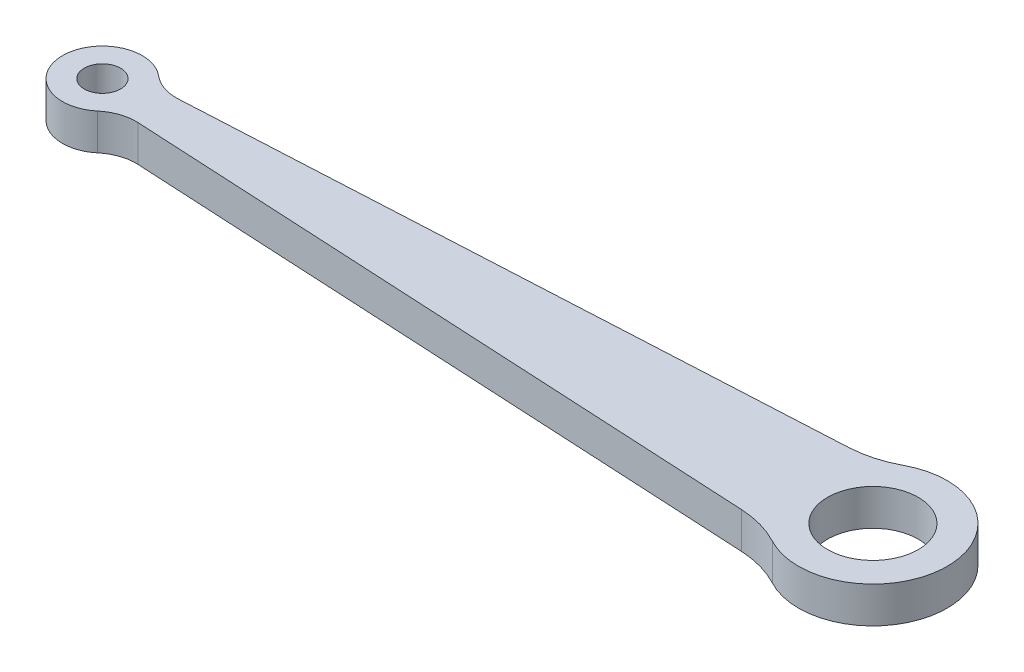
ISO-10303-21;
HEADER;
FILE_DESCRIPTION(('STEP AP214'),'2;1');
FILE_NAME('part.step','',(''),(''),'','','');
FILE_SCHEMA(('AUTOMOTIVE_DESIGN { 1 0 10303 214 1 1 1 1 }'));
ENDSEC;
DATA;
#1=APPLICATION_CONTEXT('core data for automotive mechanical design processes');
#2=APPLICATION_PROTOCOL_DEFINITION('international standard','automotive_design',2000,#1);
#3=PRODUCT_CONTEXT('',#1,'mechanical');
#4=PRODUCT('Part','Part','',(#3));
#5=PRODUCT_RELATED_PRODUCT_CATEGORY('part','',(#4));
#6=PRODUCT_DEFINITION_FORMATION('','',#4);
#7=PRODUCT_DEFINITION_CONTEXT('part definition',#1,'design');
#8=PRODUCT_DEFINITION('design','',#6,#7);
#9=PRODUCT_DEFINITION_SHAPE('','',#8);
#10=(LENGTH_UNIT() NAMED_UNIT(*) SI_UNIT(.MILLI.,.METRE.));
#11=(NAMED_UNIT(*) PLANE_ANGLE_UNIT() SI_UNIT($,.RADIAN.));
#12=(NAMED_UNIT(*) SI_UNIT($,.STERADIAN.) SOLID_ANGLE_UNIT());
#13=UNCERTAINTY_MEASURE_WITH_UNIT(LENGTH_MEASURE(1.E-05),#10,'distance_accuracy_value','');
#14=(GEOMETRIC_REPRESENTATION_CONTEXT(3) GLOBAL_UNCERTAINTY_ASSIGNED_CONTEXT((#13)) GLOBAL_UNIT_ASSIGNED_CONTEXT((#10,
#11,#12)) REPRESENTATION_CONTEXT('',''));
#15=CARTESIAN_POINT('',(0.,0.,0.));
#16=DIRECTION('',(0.,0.,1.));
#17=DIRECTION('',(1.,0.,0.));
#18=AXIS2_PLACEMENT_3D('',#15,#16,#17);
#19=CARTESIAN_POINT('',(4.70734427929749,3.175,-5.58277852741493));
#20=DIRECTION('',(0.,1.,0.));
#21=DIRECTION('',(0.,0.,1.));
#22=AXIS2_PLACEMENT_3D('',#19,#20,#21);
#23=PLANE('',#22);
#24=CARTESIAN_POINT('',(0.,3.175,0.));
#25=DIRECTION('',(0.,1.,0.));
#26=DIRECTION('',(0.,0.,1.));
#27=AXIS2_PLACEMENT_3D('',#24,#25,#26);
#28=CIRCLE('',#27,1.5875);
#29=CARTESIAN_POINT('',(0.,3.175,1.5875));
#30=VERTEX_POINT('',#29);
#31=EDGE_CURVE('E134',#30,#30,#28,.T.);
#32=ORIENTED_EDGE('',*,*,#31,.F.);
#33=EDGE_LOOP('',(#32));
#34=FACE_BOUND('',#33,.T.);
#35=CARTESIAN_POINT('',(4.70734427929749,3.175,-5.58277852741493));
#36=DIRECTION('',(0.,-1.,0.));
#37=DIRECTION('',(0.,0.,1.));
#38=AXIS2_PLACEMENT_3D('',#35,#36,#37);
#39=CIRCLE('',#38,3.81);
#40=CARTESIAN_POINT('',(4.90674427258311,3.175,-1.778));
#41=VERTEX_POINT('',#40);
#42=CARTESIAN_POINT('',(2.25133856835967,3.175,-2.67002451311149));
#43=VERTEX_POINT('',#42);
#44=EDGE_CURVE('E145',#41,#43,#39,.T.);
#45=ORIENTED_EDGE('',*,*,#44,.T.);
#46=CARTESIAN_POINT('',(0.,3.175,0.));
#47=DIRECTION('',(0.,1.,0.));
#48=DIRECTION('',(0.,0.,1.));
#49=AXIS2_PLACEMENT_3D('',#46,#47,#48);
#50=CIRCLE('',#49,3.4925);
#51=CARTESIAN_POINT('',(2.25133856835967,3.175,2.67002451311149));
#52=VERTEX_POINT('',#51);
#53=EDGE_CURVE('E93',#43,#52,#50,.T.);
#54=ORIENTED_EDGE('',*,*,#53,.T.);
#55=CARTESIAN_POINT('',(4.70734427929749,3.175,5.58277852741493));
#56=DIRECTION('',(0.,-1.,0.));
#57=DIRECTION('',(0.,0.,-1.));
#58=AXIS2_PLACEMENT_3D('',#55,#56,#57);
#59=CIRCLE('',#58,3.81);
#60=CARTESIAN_POINT('',(4.90674427258311,3.175,1.778));
#61=VERTEX_POINT('',#60);
#62=EDGE_CURVE('E160',#52,#61,#59,.T.);
#63=ORIENTED_EDGE('',*,*,#62,.T.);
#64=DIRECTION('',(0.998629534754574,0.,0.052335956242944));
#65=VECTOR('',#64,1.);
#66=CARTESIAN_POINT('',(4.90674427258311,3.175,1.778));
#67=LINE('',#66,#65);
#68=CARTESIAN_POINT('',(60.6639655636608,3.175,4.70011214685849));
#69=VERTEX_POINT('',#68);
#70=EDGE_CURVE('E173',#61,#69,#67,.T.);
#71=ORIENTED_EDGE('',*,*,#70,.T.);
#72=CARTESIAN_POINT('',(60.198698912661,3.175,13.5779287108267));
#73=DIRECTION('',(0.,-1.,0.));
#74=DIRECTION('',(0.,0.,-1.));
#75=AXIS2_PLACEMENT_3D('',#72,#73,#74);
#76=CIRCLE('',#75,8.89);
#77=CARTESIAN_POINT('',(64.3921758290629,3.175,5.73912450663807));
#78=VERTEX_POINT('',#77);
#79=EDGE_CURVE('E112',#69,#78,#76,.T.);
#80=ORIENTED_EDGE('',*,*,#79,.T.);
#81=CARTESIAN_POINT('',(67.4624,3.175,0.));
#82=DIRECTION('',(0.,1.,0.));
#83=DIRECTION('',(0.,0.,1.));
#84=AXIS2_PLACEMENT_3D('',#81,#82,#83);
#85=CIRCLE('',#84,6.50875);
#86=CARTESIAN_POINT('',(64.3921758290629,3.175,-5.73912450663807));
#87=VERTEX_POINT('',#86);
#88=EDGE_CURVE('E106',#78,#87,#85,.T.);
#89=ORIENTED_EDGE('',*,*,#88,.T.);
#90=CARTESIAN_POINT('',(60.1986989126611,3.175,-13.5779287108267));
#91=DIRECTION('',(0.,-1.,0.));
#92=DIRECTION('',(0.,0.,1.));
#93=AXIS2_PLACEMENT_3D('',#90,#91,#92);
#94=CIRCLE('',#93,8.88999999999999);
#95=CARTESIAN_POINT('',(60.6639655636609,3.175,-4.70011214685852));
#96=VERTEX_POINT('',#95);
#97=EDGE_CURVE('E110',#87,#96,#94,.T.);
#98=ORIENTED_EDGE('',*,*,#97,.T.);
#99=DIRECTION('',(-0.998629534754574,0.,0.0523359562429444));
#100=VECTOR('',#99,1.);
#101=CARTESIAN_POINT('',(4.90674427258311,3.175,-1.778));
#102=LINE('',#101,#100);
#103=EDGE_CURVE('E50',#96,#41,#102,.T.);
#104=ORIENTED_EDGE('',*,*,#103,.T.);
#105=EDGE_LOOP('',(#45,#54,#63,#71,#80,#89,#98,#104));
#106=FACE_BOUND('',#105,.T.);
#107=CARTESIAN_POINT('',(67.4624,3.175,0.));
#108=DIRECTION('',(0.,1.,0.));
#109=DIRECTION('',(0.,0.,1.));
#110=AXIS2_PLACEMENT_3D('',#107,#108,#109);
#111=CIRCLE('',#110,3.96875000000003);
#112=CARTESIAN_POINT('',(67.4624,3.175,3.96875000000003));
#113=VERTEX_POINT('',#112);
#114=EDGE_CURVE('E182',#113,#113,#111,.T.);
#115=ORIENTED_EDGE('',*,*,#114,.F.);
#116=EDGE_LOOP('',(#115));
#117=FACE_BOUND('',#116,.T.);
#118=ADVANCED_FACE('F33',(#34,#106,#117),#23,.T.);
#119=CARTESIAN_POINT('',(4.70734427929749,0.,-5.58277852741493));
#120=DIRECTION('',(0.,1.,0.));
#121=DIRECTION('',(0.,0.,1.));
#122=AXIS2_PLACEMENT_3D('',#119,#120,#121);
#123=PLANE('',#122);
#124=CARTESIAN_POINT('',(4.70734427929749,0.,-5.58277852741493));
#125=DIRECTION('',(0.,-1.,0.));
#126=DIRECTION('',(0.,0.,1.));
#127=AXIS2_PLACEMENT_3D('',#124,#125,#126);
#128=CIRCLE('',#127,3.81);
#129=CARTESIAN_POINT('',(4.90674427258311,0.,-1.778));
#130=VERTEX_POINT('',#129);
#131=CARTESIAN_POINT('',(2.25133856835967,0.,-2.67002451311149));
#132=VERTEX_POINT('',#131);
#133=EDGE_CURVE('E130',#130,#132,#128,.T.);
#134=ORIENTED_EDGE('',*,*,#133,.F.);
#135=DIRECTION('',(-0.998629534754574,0.,0.0523359562429444));
#136=VECTOR('',#135,1.);
#137=CARTESIAN_POINT('',(4.90674427258311,0.,-1.778));
#138=LINE('',#137,#136);
#139=CARTESIAN_POINT('',(60.6639655636609,0.,-4.70011214685852));
#140=VERTEX_POINT('',#139);
#141=EDGE_CURVE('E85',#140,#130,#138,.T.);
#142=ORIENTED_EDGE('',*,*,#141,.F.);
#143=CARTESIAN_POINT('',(60.1986989126611,0.,-13.5779287108267));
#144=DIRECTION('',(0.,-1.,0.));
#145=DIRECTION('',(0.,0.,1.));
#146=AXIS2_PLACEMENT_3D('',#143,#144,#145);
#147=CIRCLE('',#146,8.88999999999999);
#148=CARTESIAN_POINT('',(64.3921758290629,0.,-5.73912450663807));
#149=VERTEX_POINT('',#148);
#150=EDGE_CURVE('E79',#149,#140,#147,.T.);
#151=ORIENTED_EDGE('',*,*,#150,.F.);
#152=CARTESIAN_POINT('',(67.4624,0.,0.));
#153=DIRECTION('',(0.,1.,0.));
#154=DIRECTION('',(0.,0.,1.));
#155=AXIS2_PLACEMENT_3D('',#152,#153,#154);
#156=CIRCLE('',#155,6.50875);
#157=CARTESIAN_POINT('',(64.3921758290629,0.,5.73912450663807));
#158=VERTEX_POINT('',#157);
#159=EDGE_CURVE('E120',#158,#149,#156,.T.);
#160=ORIENTED_EDGE('',*,*,#159,.F.);
#161=CARTESIAN_POINT('',(60.198698912661,0.,13.5779287108267));
#162=DIRECTION('',(0.,-1.,0.));
#163=DIRECTION('',(0.,0.,-1.));
#164=AXIS2_PLACEMENT_3D('',#161,#162,#163);
#165=CIRCLE('',#164,8.89);
#166=CARTESIAN_POINT('',(60.6639655636608,0.,4.70011214685849));
#167=VERTEX_POINT('',#166);
#168=EDGE_CURVE('E140',#167,#158,#165,.T.);
#169=ORIENTED_EDGE('',*,*,#168,.F.);
#170=DIRECTION('',(0.998629534754574,0.,0.052335956242944));
#171=VECTOR('',#170,1.);
#172=CARTESIAN_POINT('',(4.90674427258311,0.,1.778));
#173=LINE('',#172,#171);
#174=CARTESIAN_POINT('',(4.90674427258311,0.,1.778));
#175=VERTEX_POINT('',#174);
#176=EDGE_CURVE('E138',#175,#167,#173,.T.);
#177=ORIENTED_EDGE('',*,*,#176,.F.);
#178=CARTESIAN_POINT('',(4.70734427929749,0.,5.58277852741493));
#179=DIRECTION('',(0.,-1.,0.));
#180=DIRECTION('',(0.,0.,-1.));
#181=AXIS2_PLACEMENT_3D('',#178,#179,#180);
#182=CIRCLE('',#181,3.81);
#183=CARTESIAN_POINT('',(2.25133856835967,0.,2.67002451311149));
#184=VERTEX_POINT('',#183);
#185=EDGE_CURVE('E136',#184,#175,#182,.T.);
#186=ORIENTED_EDGE('',*,*,#185,.F.);
#187=CARTESIAN_POINT('',(0.,0.,0.));
#188=DIRECTION('',(0.,1.,0.));
#189=DIRECTION('',(0.,0.,1.));
#190=AXIS2_PLACEMENT_3D('',#187,#188,#189);
#191=CIRCLE('',#190,3.4925);
#192=EDGE_CURVE('E133',#132,#184,#191,.T.);
#193=ORIENTED_EDGE('',*,*,#192,.F.);
#194=EDGE_LOOP('',(#134,#142,#151,#160,#169,#177,#186,#193));
#195=FACE_BOUND('',#194,.T.);
#196=CARTESIAN_POINT('',(0.,0.,0.));
#197=DIRECTION('',(0.,1.,0.));
#198=DIRECTION('',(0.,0.,1.));
#199=AXIS2_PLACEMENT_3D('',#196,#197,#198);
#200=CIRCLE('',#199,1.5875);
#201=CARTESIAN_POINT('',(0.,0.,1.5875));
#202=VERTEX_POINT('',#201);
#203=EDGE_CURVE('E179',#202,#202,#200,.T.);
#204=ORIENTED_EDGE('',*,*,#203,.T.);
#205=EDGE_LOOP('',(#204));
#206=FACE_BOUND('',#205,.T.);
#207=CARTESIAN_POINT('',(67.4624,0.,0.));
#208=DIRECTION('',(0.,1.,0.));
#209=DIRECTION('',(0.,0.,1.));
#210=AXIS2_PLACEMENT_3D('',#207,#208,#209);
#211=CIRCLE('',#210,3.96875000000003);
#212=CARTESIAN_POINT('',(67.4624,0.,3.96875000000003));
#213=VERTEX_POINT('',#212);
#214=EDGE_CURVE('E185',#213,#213,#211,.T.);
#215=ORIENTED_EDGE('',*,*,#214,.T.);
#216=EDGE_LOOP('',(#215));
#217=FACE_BOUND('',#216,.T.);
#218=ADVANCED_FACE('F164',(#195,#206,#217),#123,.F.);
#219=CARTESIAN_POINT('',(4.70734427929749,3.175,-5.58277852741493));
#220=DIRECTION('',(0.,-1.,0.));
#221=DIRECTION('',(0.,0.,-1.));
#222=AXIS2_PLACEMENT_3D('',#219,#220,#221);
#223=CYLINDRICAL_SURFACE('',#222,3.81);
#224=ORIENTED_EDGE('',*,*,#133,.T.);
#225=DIRECTION('',(0.,-1.,0.));
#226=VECTOR('',#225,1.);
#227=CARTESIAN_POINT('',(2.25133856835967,3.175,-2.67002451311149));
#228=LINE('',#227,#226);
#229=EDGE_CURVE('E11',#43,#132,#228,.T.);
#230=ORIENTED_EDGE('',*,*,#229,.F.);
#231=ORIENTED_EDGE('',*,*,#44,.F.);
#232=DIRECTION('',(0.,-1.,0.));
#233=VECTOR('',#232,1.);
#234=CARTESIAN_POINT('',(4.90674427258311,3.175,-1.778));
#235=LINE('',#234,#233);
#236=EDGE_CURVE('E126',#41,#130,#235,.T.);
#237=ORIENTED_EDGE('',*,*,#236,.T.);
#238=EDGE_LOOP('',(#224,#230,#231,#237));
#239=FACE_BOUND('',#238,.T.);
#240=ADVANCED_FACE('F35',(#239),#223,.F.);
#241=CARTESIAN_POINT('',(0.,3.175,0.));
#242=DIRECTION('',(0.,-1.,0.));
#243=DIRECTION('',(0.,0.,-1.));
#244=AXIS2_PLACEMENT_3D('',#241,#242,#243);
#245=CYLINDRICAL_SURFACE('',#244,3.4925);
#246=ORIENTED_EDGE('',*,*,#192,.T.);
#247=DIRECTION('',(0.,-1.,0.));
#248=VECTOR('',#247,1.);
#249=CARTESIAN_POINT('',(2.25133856835967,3.175,2.67002451311149));
#250=LINE('',#249,#248);
#251=EDGE_CURVE('E42',#52,#184,#250,.T.);
#252=ORIENTED_EDGE('',*,*,#251,.F.);
#253=ORIENTED_EDGE('',*,*,#53,.F.);
#254=ORIENTED_EDGE('',*,*,#229,.T.);
#255=EDGE_LOOP('',(#246,#252,#253,#254));
#256=FACE_BOUND('',#255,.T.);
#257=ADVANCED_FACE('F217',(#256),#245,.T.);
#258=CARTESIAN_POINT('',(4.70734427929749,3.175,5.58277852741493));
#259=DIRECTION('',(0.,-1.,0.));
#260=DIRECTION('',(0.,0.,-1.));
#261=AXIS2_PLACEMENT_3D('',#258,#259,#260);
#262=CYLINDRICAL_SURFACE('',#261,3.81);
#263=ORIENTED_EDGE('',*,*,#185,.T.);
#264=DIRECTION('',(0.,-1.,0.));
#265=VECTOR('',#264,1.);
#266=CARTESIAN_POINT('',(4.90674427258311,3.175,1.778));
#267=LINE('',#266,#265);
#268=EDGE_CURVE('E152',#61,#175,#267,.T.);
#269=ORIENTED_EDGE('',*,*,#268,.F.);
#270=ORIENTED_EDGE('',*,*,#62,.F.);
#271=ORIENTED_EDGE('',*,*,#251,.T.);
#272=EDGE_LOOP('',(#263,#269,#270,#271));
#273=FACE_BOUND('',#272,.T.);
#274=ADVANCED_FACE('F158',(#273),#262,.F.);
#275=CARTESIAN_POINT('',(4.90674427258311,3.175,1.778));
#276=DIRECTION('',(0.052335956242944,0.,-0.998629534754574));
#277=DIRECTION('',(-0.998629534754574,0.,-0.052335956242944));
#278=AXIS2_PLACEMENT_3D('',#275,#276,#277);
#279=PLANE('',#278);
#280=ORIENTED_EDGE('',*,*,#176,.T.);
#281=DIRECTION('',(0.,-1.,0.));
#282=VECTOR('',#281,1.);
#283=CARTESIAN_POINT('',(60.6639655636608,3.175,4.70011214685849));
#284=LINE('',#283,#282);
#285=EDGE_CURVE('E149',#69,#167,#284,.T.);
#286=ORIENTED_EDGE('',*,*,#285,.F.);
#287=ORIENTED_EDGE('',*,*,#70,.F.);
#288=ORIENTED_EDGE('',*,*,#268,.T.);
#289=EDGE_LOOP('',(#280,#286,#287,#288));
#290=FACE_BOUND('',#289,.T.);
#291=ADVANCED_FACE('F169',(#290),#279,.F.);
#292=CARTESIAN_POINT('',(60.198698912661,3.175,13.5779287108267));
#293=DIRECTION('',(0.,-1.,0.));
#294=DIRECTION('',(0.,0.,-1.));
#295=AXIS2_PLACEMENT_3D('',#292,#293,#294);
#296=CYLINDRICAL_SURFACE('',#295,8.89);
#297=ORIENTED_EDGE('',*,*,#168,.T.);
#298=DIRECTION('',(0.,-1.,0.));
#299=VECTOR('',#298,1.);
#300=CARTESIAN_POINT('',(64.3921758290629,3.175,5.73912450663807));
#301=LINE('',#300,#299);
#302=EDGE_CURVE('E121',#78,#158,#301,.T.);
#303=ORIENTED_EDGE('',*,*,#302,.F.);
#304=ORIENTED_EDGE('',*,*,#79,.F.);
#305=ORIENTED_EDGE('',*,*,#285,.T.);
#306=EDGE_LOOP('',(#297,#303,#304,#305));
#307=FACE_BOUND('',#306,.T.);
#308=ADVANCED_FACE('F172',(#307),#296,.F.);
#309=CARTESIAN_POINT('',(67.4624,3.175,0.));
#310=DIRECTION('',(0.,-1.,0.));
#311=DIRECTION('',(0.,0.,-1.));
#312=AXIS2_PLACEMENT_3D('',#309,#310,#311);
#313=CYLINDRICAL_SURFACE('',#312,6.50875);
#314=ORIENTED_EDGE('',*,*,#159,.T.);
#315=DIRECTION('',(0.,-1.,0.));
#316=VECTOR('',#315,1.);
#317=CARTESIAN_POINT('',(64.3921758290629,3.175,-5.73912450663807));
#318=LINE('',#317,#316);
#319=EDGE_CURVE('E117',#87,#149,#318,.T.);
#320=ORIENTED_EDGE('',*,*,#319,.F.);
#321=ORIENTED_EDGE('',*,*,#88,.F.);
#322=ORIENTED_EDGE('',*,*,#302,.T.);
#323=EDGE_LOOP('',(#314,#320,#321,#322));
#324=FACE_BOUND('',#323,.T.);
#325=ADVANCED_FACE('F118',(#324),#313,.T.);
#326=CARTESIAN_POINT('',(60.1986989126611,3.175,-13.5779287108267));
#327=DIRECTION('',(0.,-1.,0.));
#328=DIRECTION('',(0.,0.,-1.));
#329=AXIS2_PLACEMENT_3D('',#326,#327,#328);
#330=CYLINDRICAL_SURFACE('',#329,8.88999999999999);
#331=ORIENTED_EDGE('',*,*,#150,.T.);
#332=DIRECTION('',(0.,-1.,0.));
#333=VECTOR('',#332,1.);
#334=CARTESIAN_POINT('',(60.6639655636609,3.175,-4.70011214685852));
#335=LINE('',#334,#333);
#336=EDGE_CURVE('E122',#96,#140,#335,.T.);
#337=ORIENTED_EDGE('',*,*,#336,.F.);
#338=ORIENTED_EDGE('',*,*,#97,.F.);
#339=ORIENTED_EDGE('',*,*,#319,.T.);
#340=EDGE_LOOP('',(#331,#337,#338,#339));
#341=FACE_BOUND('',#340,.T.);
#342=ADVANCED_FACE('F124',(#341),#330,.F.);
#343=CARTESIAN_POINT('',(4.90674427258311,3.175,-1.778));
#344=DIRECTION('',(0.0523359562429444,0.,0.998629534754574));
#345=DIRECTION('',(0.998629534754574,0.,-0.0523359562429444));
#346=AXIS2_PLACEMENT_3D('',#343,#344,#345);
#347=PLANE('',#346);
#348=ORIENTED_EDGE('',*,*,#141,.T.);
#349=ORIENTED_EDGE('',*,*,#236,.F.);
#350=ORIENTED_EDGE('',*,*,#103,.F.);
#351=ORIENTED_EDGE('',*,*,#336,.T.);
#352=EDGE_LOOP('',(#348,#349,#350,#351));
#353=FACE_BOUND('',#352,.T.);
#354=ADVANCED_FACE('F205',(#353),#347,.F.);
#355=CARTESIAN_POINT('',(0.,3.175,0.));
#356=DIRECTION('',(0.,-1.,0.));
#357=DIRECTION('',(0.,0.,-1.));
#358=AXIS2_PLACEMENT_3D('',#355,#356,#357);
#359=CYLINDRICAL_SURFACE('',#358,1.5875);
#360=ORIENTED_EDGE('',*,*,#31,.T.);
#361=EDGE_LOOP('',(#360));
#362=FACE_BOUND('',#361,.T.);
#363=ORIENTED_EDGE('',*,*,#203,.F.);
#364=EDGE_LOOP('',(#363));
#365=FACE_BOUND('',#364,.T.);
#366=ADVANCED_FACE('F202',(#362,#365),#359,.F.);
#367=CARTESIAN_POINT('',(67.4624,3.175,0.));
#368=DIRECTION('',(0.,-1.,0.));
#369=DIRECTION('',(0.,0.,-1.));
#370=AXIS2_PLACEMENT_3D('',#367,#368,#369);
#371=CYLINDRICAL_SURFACE('',#370,3.96875000000003);
#372=ORIENTED_EDGE('',*,*,#114,.T.);
#373=EDGE_LOOP('',(#372));
#374=FACE_BOUND('',#373,.T.);
#375=ORIENTED_EDGE('',*,*,#214,.F.);
#376=EDGE_LOOP('',(#375));
#377=FACE_BOUND('',#376,.T.);
#378=ADVANCED_FACE('F191',(#374,#377),#371,.F.);
#379=CLOSED_SHELL('',(#118,#218,#240,#257,#274,#291,#308,#325,#342,#354,#366,#378));
#380=MANIFOLD_SOLID_BREP('B2',#379);
#381=ADVANCED_BREP_SHAPE_REPRESENTATION('',(#18,#380),#14);
#382=SHAPE_DEFINITION_REPRESENTATION(#9,#381);
ENDSEC;
END-ISO-10303-21;
